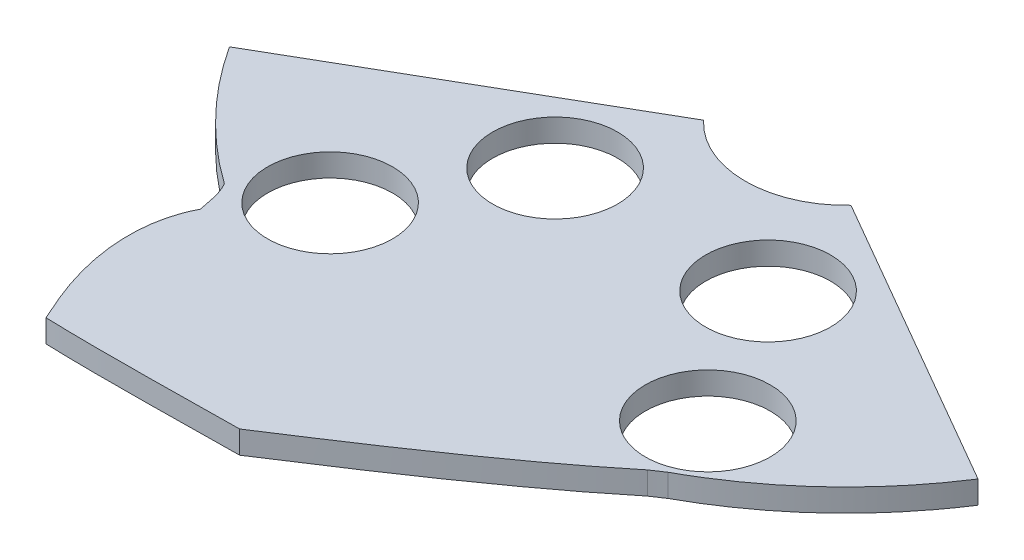
ISO-10303-21;
HEADER;
FILE_DESCRIPTION(('STEP AP214'),'2;1');
FILE_NAME('part.step','',(''),(''),'','','');
FILE_SCHEMA(('AUTOMOTIVE_DESIGN { 1 0 10303 214 1 1 1 1 }'));
ENDSEC;
DATA;
#1=APPLICATION_CONTEXT('core data for automotive mechanical design processes');
#2=APPLICATION_PROTOCOL_DEFINITION('international standard','automotive_design',2000,#1);
#3=PRODUCT_CONTEXT('',#1,'mechanical');
#4=PRODUCT('Part','Part','',(#3));
#5=PRODUCT_RELATED_PRODUCT_CATEGORY('part','',(#4));
#6=PRODUCT_DEFINITION_FORMATION('','',#4);
#7=PRODUCT_DEFINITION_CONTEXT('part definition',#1,'design');
#8=PRODUCT_DEFINITION('design','',#6,#7);
#9=PRODUCT_DEFINITION_SHAPE('','',#8);
#10=(LENGTH_UNIT() NAMED_UNIT(*) SI_UNIT(.MILLI.,.METRE.));
#11=(NAMED_UNIT(*) PLANE_ANGLE_UNIT() SI_UNIT($,.RADIAN.));
#12=(NAMED_UNIT(*) SI_UNIT($,.STERADIAN.) SOLID_ANGLE_UNIT());
#13=UNCERTAINTY_MEASURE_WITH_UNIT(LENGTH_MEASURE(1.E-05),#10,'distance_accuracy_value','');
#14=(GEOMETRIC_REPRESENTATION_CONTEXT(3) GLOBAL_UNCERTAINTY_ASSIGNED_CONTEXT((#13)) GLOBAL_UNIT_ASSIGNED_CONTEXT((#10,
#11,#12)) REPRESENTATION_CONTEXT('',''));
#15=CARTESIAN_POINT('',(0.,0.,0.));
#16=DIRECTION('',(0.,0.,1.));
#17=DIRECTION('',(1.,0.,0.));
#18=AXIS2_PLACEMENT_3D('',#15,#16,#17);
#19=CARTESIAN_POINT('',(-56.6884858522696,-91.736,54.301261576579));
#20=DIRECTION('',(0.,-1.,0.));
#21=DIRECTION('',(0.,0.,-1.));
#22=AXIS2_PLACEMENT_3D('',#19,#20,#21);
#23=PLANE('',#22);
#24=CARTESIAN_POINT('',(18.75,-91.736,32.476));
#25=DIRECTION('',(0.,-1.,0.));
#26=DIRECTION('',(0.,0.,-1.));
#27=AXIS2_PLACEMENT_3D('',#24,#25,#26);
#28=CIRCLE('',#27,10.999845998306);
#29=CARTESIAN_POINT('',(18.75,-91.736,21.476154001694));
#30=VERTEX_POINT('',#29);
#31=EDGE_CURVE('E441',#30,#30,#28,.T.);
#32=ORIENTED_EDGE('',*,*,#31,.F.);
#33=EDGE_LOOP('',(#32));
#34=FACE_BOUND('',#33,.T.);
#35=CARTESIAN_POINT('',(-33.25,-91.736,57.591));
#36=DIRECTION('',(0.,-1.,0.));
#37=DIRECTION('',(0.,0.,-1.));
#38=AXIS2_PLACEMENT_3D('',#35,#36,#37);
#39=CIRCLE('',#38,10.999845998306);
#40=CARTESIAN_POINT('',(-33.25,-91.736,46.591154001694));
#41=VERTEX_POINT('',#40);
#42=EDGE_CURVE('E422',#41,#41,#39,.T.);
#43=ORIENTED_EDGE('',*,*,#42,.F.);
#44=EDGE_LOOP('',(#43));
#45=FACE_BOUND('',#44,.T.);
#46=CARTESIAN_POINT('',(-65.8942438215736,-91.736,42.6629141284688));
#47=CARTESIAN_POINT('',(-64.5474908601946,-91.736,44.7422746970416));
#48=CARTESIAN_POINT('',(-63.1027512089931,-91.736,46.7591809472804));
#49=CARTESIAN_POINT('',(-60.0311648745791,-91.736,50.6430314481892));
#50=CARTESIAN_POINT('',(-58.4020734791186,-91.736,52.512507702137));
#51=CARTESIAN_POINT('',(-53.2612747027594,-91.736,57.878806795853));
#52=CARTESIAN_POINT('',(-49.496356291069,-91.736,61.1304947701738));
#53=CARTESIAN_POINT('',(-45.4574809101117,-91.736,63.9990028967301));
#54=B_SPLINE_CURVE_WITH_KNOTS('',3,(#46,#47,#48,#49,#50,#51,#52,#53),.UNSPECIFIED.,.F.,.F.,(4,2,
2,4),(0.,0.25,0.5,0.999998503744995),.UNSPECIFIED.);
#55=CARTESIAN_POINT('',(-45.4574809101117,-91.736,63.9990028967301));
#56=VERTEX_POINT('',#55);
#57=CARTESIAN_POINT('',(-65.8942438215736,-91.736,42.6629141284688));
#58=VERTEX_POINT('',#57);
#59=EDGE_CURVE('E378',#56,#58,#54,.F.);
#60=ORIENTED_EDGE('',*,*,#59,.T.);
#61=DIRECTION('',(0.866025113443951,0.,-0.500000502884138));
#62=VECTOR('',#61,1.);
#63=CARTESIAN_POINT('',(-65.8942438215736,-91.736,42.6629141284688));
#64=LINE('',#63,#62);
#65=CARTESIAN_POINT('',(-12.9766531358799,-91.736,12.1108879302399));
#66=VERTEX_POINT('',#65);
#67=EDGE_CURVE('E103',#58,#66,#64,.T.);
#68=ORIENTED_EDGE('',*,*,#67,.T.);
#69=CARTESIAN_POINT('',(0.,-91.736,0.));
#70=DIRECTION('',(0.,1.,0.));
#71=DIRECTION('',(0.,0.,-1.));
#72=AXIS2_PLACEMENT_3D('',#69,#70,#71);
#73=CIRCLE('',#72,17.7501305084715);
#74=CARTESIAN_POINT('',(12.9766531358511,-91.736,12.1108879302707));
#75=VERTEX_POINT('',#74);
#76=EDGE_CURVE('E272',#66,#75,#73,.T.);
#77=ORIENTED_EDGE('',*,*,#76,.T.);
#78=DIRECTION('',(0.866025113442765,0.,0.500000502886192));
#79=VECTOR('',#78,1.);
#80=CARTESIAN_POINT('',(12.9766531358511,-91.736,12.1108879302707));
#81=LINE('',#80,#79);
#82=CARTESIAN_POINT('',(65.8946490574718,-91.736,42.6631480920524));
#83=VERTEX_POINT('',#82);
#84=EDGE_CURVE('E249',#75,#83,#81,.T.);
#85=ORIENTED_EDGE('',*,*,#84,.T.);
#86=CARTESIAN_POINT('',(37.5957197584784,-91.736,68.9109267864233));
#87=CARTESIAN_POINT('',(40.4495953099681,-91.736,67.3534566445792));
#88=CARTESIAN_POINT('',(43.204718398884,-91.736,65.6218564831745));
#89=CARTESIAN_POINT('',(48.4802343379206,-91.736,61.824946723478));
#90=CARTESIAN_POINT('',(51.001907321745,-91.736,59.7629238479459));
#91=CARTESIAN_POINT('',(55.7673162148434,-91.736,55.3437989947092));
#92=CARTESIAN_POINT('',(58.0128073926613,-91.736,52.9858013582049));
#93=CARTESIAN_POINT('',(62.1928793347426,-91.736,48.0099855299953));
#94=CARTESIAN_POINT('',(64.1285228158726,-91.736,45.3912298354426));
#95=CARTESIAN_POINT('',(65.8946490574718,-91.736,42.6631480920524));
#96=B_SPLINE_CURVE_WITH_KNOTS('',3,(#86,#87,#88,#89,#90,#91,#92,#93,#94,#95),.UNSPECIFIED.,.F.,
.F.,(4,2,2,2,4),(0.,0.25,0.5,0.75,1.),.UNSPECIFIED.);
#97=CARTESIAN_POINT('',(37.5957197584784,-91.736,68.9109267864233));
#98=VERTEX_POINT('',#97);
#99=EDGE_CURVE('E244',#83,#98,#96,.F.);
#100=ORIENTED_EDGE('',*,*,#99,.T.);
#101=CARTESIAN_POINT('',(35.4050091196591,-91.736,70.3787300846418));
#102=CARTESIAN_POINT('',(35.5953555222512,-91.736,70.2464927646807));
#103=CARTESIAN_POINT('',(35.9696760657468,-91.736,69.9864450579514));
#104=CARTESIAN_POINT('',(36.5268235358578,-91.736,69.6112346563219));
#105=CARTESIAN_POINT('',(37.0663579190638,-91.736,69.2536370543177));
#106=CARTESIAN_POINT('',(37.4216631977097,-91.736,69.0236115123833));
#107=CARTESIAN_POINT('',(37.5957204018097,-91.736,68.9109264353326));
#108=B_SPLINE_CURVE_WITH_KNOTS('',3,(#101,#102,#103,#104,#105,#106,#107),.UNSPECIFIED.,.F.,.F.,
(4,1,1,1,4),(0.,0.263661321014348,0.518496003270313,0.764120477598354,0.999999722877412),.UNSPECIFIED.);
#109=CARTESIAN_POINT('',(35.4050091196591,-91.736,70.3787300846418));
#110=VERTEX_POINT('',#109);
#111=EDGE_CURVE('E321',#98,#110,#108,.F.);
#112=ORIENTED_EDGE('',*,*,#111,.T.);
#113=CARTESIAN_POINT('',(-6.73253175991147,-91.736,100.037170561056));
#114=CARTESIAN_POINT('',(-5.34630660215472,-91.736,99.1392344509291));
#115=CARTESIAN_POINT('',(-2.80167332759808,-91.736,97.4909321592919));
#116=CARTESIAN_POINT('',(3.17006895406922,-91.736,93.5946947569014));
#117=CARTESIAN_POINT('',(10.7122803870103,-91.736,88.5936129436204));
#118=CARTESIAN_POINT('',(17.489969662467,-91.736,83.900170257636));
#119=CARTESIAN_POINT('',(21.3258616627546,-91.736,81.1520962084655));
#120=CARTESIAN_POINT('',(23.185664611394,-91.736,79.8062689400434));
#121=CARTESIAN_POINT('',(25.1931857881614,-91.736,78.3306274279739));
#122=CARTESIAN_POINT('',(27.3354217863764,-91.736,76.7257185403757));
#123=CARTESIAN_POINT('',(28.9937595264603,-91.736,75.462880515536));
#124=CARTESIAN_POINT('',(30.4639698484272,-91.736,74.3264825266474));
#125=CARTESIAN_POINT('',(31.7482003840499,-91.736,73.3209545373628));
#126=CARTESIAN_POINT('',(32.9984502753082,-91.736,72.3287805314806));
#127=CARTESIAN_POINT('',(34.2150720365226,-91.736,71.3513047612209));
#128=CARTESIAN_POINT('',(35.0114565070231,-91.736,70.7003936884527));
#129=CARTESIAN_POINT('',(35.4050097024483,-91.736,70.3787297910331));
#130=B_SPLINE_CURVE_WITH_KNOTS('',3,(#113,#114,#115,#116,#117,#118,#119,#120,#121,#122,#123,
#124,#125,#126,#127,#128,#129),.UNSPECIFIED.,.F.,.F.,(4,1,1,1,1,1,1,1,1,1,1,1,1,1,4),
(1.23564092291417E-08,0.0961072285133107,0.176419852084043,0.414910652755476,0.622676188591791,
0.656085661289299,0.689485728620418,0.756258931920965,0.801061746391034,0.845241119834624,
0.877548504882489,0.909188245912283,0.940149897490484,0.970423589379137,1.),.UNSPECIFIED.);
#131=CARTESIAN_POINT('',(-6.73253175991147,-91.736,100.037170561056));
#132=VERTEX_POINT('',#131);
#133=EDGE_CURVE('E129',#110,#132,#130,.F.);
#134=ORIENTED_EDGE('',*,*,#133,.T.);
#135=CARTESIAN_POINT('',(-6.73253175991147,-91.736,100.037170561056));
#136=CARTESIAN_POINT('',(-18.3266394816797,-91.736,100.149679243875));
#137=CARTESIAN_POINT('',(-30.1799119938619,-91.736,100.458313603783));
#138=CARTESIAN_POINT('',(-40.7448806088915,-91.736,100.117358231126));
#139=B_SPLINE_CURVE_WITH_KNOTS('',3,(#135,#136,#137,#138),.UNSPECIFIED.,.F.,.F.,(4,4),
(-7.58549912933041E-06,1.00000185032628),.UNSPECIFIED.);
#140=CARTESIAN_POINT('',(-40.7448806088915,-91.736,100.117358231126));
#141=VERTEX_POINT('',#140);
#142=EDGE_CURVE('E122',#132,#141,#139,.T.);
#143=ORIENTED_EDGE('',*,*,#142,.T.);
#144=CARTESIAN_POINT('',(-43.69978000817,-91.736,69.9751321491997));
#145=CARTESIAN_POINT('',(-43.8258751992396,-91.736,70.2229224087127));
#146=CARTESIAN_POINT('',(-44.0777675180425,-91.736,70.7179167558832));
#147=CARTESIAN_POINT('',(-44.4120485944769,-91.736,71.4806829738377));
#148=CARTESIAN_POINT('',(-44.7145916870787,-91.736,72.2554495832917));
#149=CARTESIAN_POINT('',(-44.9831339082681,-91.736,73.0429860342755));
#150=CARTESIAN_POINT('',(-45.388318048313,-91.736,74.4135641806145));
#151=CARTESIAN_POINT('',(-45.8049760848263,-91.736,76.4257385547271));
#152=CARTESIAN_POINT('',(-46.0479550109228,-91.736,79.0521988723503));
#153=CARTESIAN_POINT('',(-46.0355249732305,-91.736,81.7228745288368));
#154=CARTESIAN_POINT('',(-45.7997248202168,-91.736,84.3704180167646));
#155=CARTESIAN_POINT('',(-45.3644099415651,-91.736,87.0193280475513));
#156=CARTESIAN_POINT('',(-44.7603474208787,-91.736,89.6091433834553));
#157=CARTESIAN_POINT('',(-44.126122264983,-91.736,91.7306709927925));
#158=CARTESIAN_POINT('',(-43.5526828789689,-91.736,93.4005265005966));
#159=CARTESIAN_POINT('',(-42.9391785439354,-91.736,95.0540720782557));
#160=CARTESIAN_POINT('',(-42.103875606645,-91.736,97.0959121184689));
#161=CARTESIAN_POINT('',(-41.2953680536431,-91.736,98.9105742493697));
#162=CARTESIAN_POINT('',(-40.8369102206711,-91.736,99.9156100125213));
#163=CARTESIAN_POINT('',(-40.7448806088915,-91.736,100.117358231126));
#164=B_SPLINE_CURVE_WITH_KNOTS('',3,(#144,#145,#146,#147,#148,#149,#150,#151,#152,#153,#154,
#155,#156,#157,#158,#159,#160,#161,#162,#163),.UNSPECIFIED.,.F.,.F.,(4,1,1,1,1,1,1,1,1,1,1,1,1,
1,1,1,1,4),(-4.6314063695263E-12,0.0265900897019296,0.0531172873806723,0.0796200806786659,
0.106131698240757,0.132680609636152,0.216304254194175,0.302163519882833,0.384535352486102,
0.471439613819969,0.556140868642182,0.641112876834887,0.725644631248309,0.767823389742302,
0.809984304263501,0.89433397824993,0.978789150698395,1.00000033554632),.UNSPECIFIED.);
#165=CARTESIAN_POINT('',(-43.69978000817,-91.736,69.9751321491997));
#166=VERTEX_POINT('',#165);
#167=EDGE_CURVE('E126',#141,#166,#164,.F.);
#168=ORIENTED_EDGE('',*,*,#167,.T.);
#169=CARTESIAN_POINT('',(-45.4574809101117,-91.736,63.9990028967301));
#170=CARTESIAN_POINT('',(-45.4156967068917,-91.736,64.073122017678));
#171=CARTESIAN_POINT('',(-45.3329191841185,-91.736,64.219957346526));
#172=CARTESIAN_POINT('',(-45.2176051404198,-91.736,64.4423313005604));
#173=CARTESIAN_POINT('',(-45.088200084432,-91.736,64.7081920485171));
#174=CARTESIAN_POINT('',(-44.9482419680022,-91.736,65.0234279414939));
#175=CARTESIAN_POINT('',(-44.7576372970209,-91.736,65.5031657963035));
#176=CARTESIAN_POINT('',(-44.5479965677649,-91.736,66.129307159601));
#177=CARTESIAN_POINT('',(-44.3472502154352,-91.736,66.8711728721295));
#178=CARTESIAN_POINT('',(-44.1696646182759,-91.736,67.6547978744291));
#179=CARTESIAN_POINT('',(-44.0119661161652,-91.736,68.4331426291323));
#180=CARTESIAN_POINT('',(-43.8875510527751,-91.736,69.0693352643155));
#181=CARTESIAN_POINT('',(-43.7846865828507,-91.736,69.5755456512685));
#182=CARTESIAN_POINT('',(-43.7323458446686,-91.736,69.8218712058832));
#183=CARTESIAN_POINT('',(-43.69978000817,-91.736,69.9751321491997));
#184=B_SPLINE_CURVE_WITH_KNOTS('',3,(#169,#170,#171,#172,#173,#174,#175,#176,#177,#178,#179,
#180,#181,#182,#183),.UNSPECIFIED.,.F.,.F.,(4,1,1,1,1,1,1,1,1,1,1,1,4),(0.,0.0407768066016325,
0.0807817973780872,0.12003239966095,0.182477563502951,0.246034951419214,0.367385225286607,
0.498698061298083,0.614216378888804,0.752427544621535,0.879305034699485,0.924904082872548,
0.999997651810928),.UNSPECIFIED.);
#185=EDGE_CURVE('E51',#166,#56,#184,.F.);
#186=ORIENTED_EDGE('',*,*,#185,.T.);
#187=EDGE_LOOP('',(#60,#68,#77,#85,#100,#112,#134,#143,#168,#186));
#188=FACE_BOUND('',#187,.T.);
#189=CARTESIAN_POINT('',(33.25,-91.736,57.591));
#190=DIRECTION('',(0.,-1.,0.));
#191=DIRECTION('',(0.,0.,-1.));
#192=AXIS2_PLACEMENT_3D('',#189,#190,#191);
#193=CIRCLE('',#192,10.999845998306);
#194=CARTESIAN_POINT('',(33.25,-91.736,46.591154001694));
#195=VERTEX_POINT('',#194);
#196=EDGE_CURVE('E429',#195,#195,#193,.T.);
#197=ORIENTED_EDGE('',*,*,#196,.F.);
#198=EDGE_LOOP('',(#197));
#199=FACE_BOUND('',#198,.T.);
#200=CARTESIAN_POINT('',(-18.75,-91.736,32.476));
#201=DIRECTION('',(0.,-1.,0.));
#202=DIRECTION('',(0.,0.,-1.));
#203=AXIS2_PLACEMENT_3D('',#200,#201,#202);
#204=CIRCLE('',#203,10.999845998306);
#205=CARTESIAN_POINT('',(-18.75,-91.736,21.476154001694));
#206=VERTEX_POINT('',#205);
#207=EDGE_CURVE('E447',#206,#206,#204,.T.);
#208=ORIENTED_EDGE('',*,*,#207,.F.);
#209=EDGE_LOOP('',(#208));
#210=FACE_BOUND('',#209,.T.);
#211=ADVANCED_FACE('F30',(#34,#45,#188,#199,#210),#23,.T.);
#212=CARTESIAN_POINT('',(-56.6884858522696,-87.736,54.301261576579));
#213=DIRECTION('',(0.,-1.,0.));
#214=DIRECTION('',(0.,0.,-1.));
#215=AXIS2_PLACEMENT_3D('',#212,#213,#214);
#216=PLANE('',#215);
#217=CARTESIAN_POINT('',(18.75,-87.736,32.476));
#218=DIRECTION('',(0.,-1.,0.));
#219=DIRECTION('',(0.,0.,-1.));
#220=AXIS2_PLACEMENT_3D('',#217,#218,#219);
#221=CIRCLE('',#220,10.999845998306);
#222=CARTESIAN_POINT('',(18.75,-87.736,21.476154001694));
#223=VERTEX_POINT('',#222);
#224=EDGE_CURVE('E444',#223,#223,#221,.T.);
#225=ORIENTED_EDGE('',*,*,#224,.T.);
#226=EDGE_LOOP('',(#225));
#227=FACE_BOUND('',#226,.T.);
#228=CARTESIAN_POINT('',(-33.25,-87.736,57.591));
#229=DIRECTION('',(0.,-1.,0.));
#230=DIRECTION('',(0.,0.,-1.));
#231=AXIS2_PLACEMENT_3D('',#228,#229,#230);
#232=CIRCLE('',#231,10.999845998306);
#233=CARTESIAN_POINT('',(-33.25,-87.736,46.591154001694));
#234=VERTEX_POINT('',#233);
#235=EDGE_CURVE('E424',#234,#234,#232,.T.);
#236=ORIENTED_EDGE('',*,*,#235,.T.);
#237=EDGE_LOOP('',(#236));
#238=FACE_BOUND('',#237,.T.);
#239=CARTESIAN_POINT('',(-45.4574809101117,-87.736,63.9990028967301));
#240=CARTESIAN_POINT('',(-49.496356291069,-87.736,61.1304947701738));
#241=CARTESIAN_POINT('',(-53.2612747027594,-87.736,57.878806795853));
#242=CARTESIAN_POINT('',(-58.4020734791186,-87.736,52.512507702137));
#243=CARTESIAN_POINT('',(-60.0311648745791,-87.736,50.6430314481892));
#244=CARTESIAN_POINT('',(-63.1027512089931,-87.736,46.7591809472804));
#245=CARTESIAN_POINT('',(-64.5474908601946,-87.736,44.7422746970416));
#246=CARTESIAN_POINT('',(-65.8942438215736,-87.736,42.6629141284688));
#247=B_SPLINE_CURVE_WITH_KNOTS('',3,(#239,#240,#241,#242,#243,#244,#245,#246),.UNSPECIFIED.,.F.,
.F.,(4,2,2,4),(0.,0.499998503744997,0.749998503744997,0.999998503744995),.UNSPECIFIED.);
#248=CARTESIAN_POINT('',(-45.4574809101117,-87.736,63.9990028967301));
#249=VERTEX_POINT('',#248);
#250=CARTESIAN_POINT('',(-65.8942438215736,-87.736,42.6629141284688));
#251=VERTEX_POINT('',#250);
#252=EDGE_CURVE('E405',#249,#251,#247,.T.);
#253=ORIENTED_EDGE('',*,*,#252,.F.);
#254=CARTESIAN_POINT('',(-43.69978000817,-87.736,69.9751321491997));
#255=CARTESIAN_POINT('',(-43.7323458446686,-87.736,69.8218712058832));
#256=CARTESIAN_POINT('',(-43.7846865828507,-87.736,69.5755456512685));
#257=CARTESIAN_POINT('',(-43.8875510527751,-87.736,69.0693352643155));
#258=CARTESIAN_POINT('',(-44.0119661161652,-87.736,68.4331426291323));
#259=CARTESIAN_POINT('',(-44.1696646182759,-87.736,67.6547978744291));
#260=CARTESIAN_POINT('',(-44.3472502154352,-87.736,66.8711728721295));
#261=CARTESIAN_POINT('',(-44.5479965677649,-87.736,66.129307159601));
#262=CARTESIAN_POINT('',(-44.7576372970209,-87.736,65.5031657963035));
#263=CARTESIAN_POINT('',(-44.9482419680022,-87.736,65.0234279414939));
#264=CARTESIAN_POINT('',(-45.088200084432,-87.736,64.7081920485171));
#265=CARTESIAN_POINT('',(-45.2176051404198,-87.736,64.4423313005604));
#266=CARTESIAN_POINT('',(-45.3329191841185,-87.736,64.219957346526));
#267=CARTESIAN_POINT('',(-45.4156967068917,-87.736,64.073122017678));
#268=CARTESIAN_POINT('',(-45.4574809101117,-87.736,63.9990028967301));
#269=B_SPLINE_CURVE_WITH_KNOTS('',3,(#254,#255,#256,#257,#258,#259,#260,#261,#262,#263,#264,
#265,#266,#267,#268),.UNSPECIFIED.,.F.,.F.,(4,1,1,1,1,1,1,1,1,1,1,1,4),(0.,0.0750935689383686,
0.120692617111432,0.247570107189382,0.385781272922112,0.501299590512833,0.632612426524309,
0.753962700391702,0.817520088307965,0.879965252149966,0.919215854432829,0.959220845209284,
0.999997651810928),.UNSPECIFIED.);
#270=CARTESIAN_POINT('',(-43.69978000817,-87.736,69.9751321491997));
#271=VERTEX_POINT('',#270);
#272=EDGE_CURVE('E94',#271,#249,#269,.T.);
#273=ORIENTED_EDGE('',*,*,#272,.F.);
#274=CARTESIAN_POINT('',(-40.7448806088915,-87.736,100.117358231126));
#275=CARTESIAN_POINT('',(-40.8369102206711,-87.736,99.9156100125213));
#276=CARTESIAN_POINT('',(-41.2953680536431,-87.736,98.9105742493697));
#277=CARTESIAN_POINT('',(-42.103875606645,-87.736,97.0959121184689));
#278=CARTESIAN_POINT('',(-42.9391785439354,-87.736,95.0540720782557));
#279=CARTESIAN_POINT('',(-43.5526828789689,-87.736,93.4005265005966));
#280=CARTESIAN_POINT('',(-44.126122264983,-87.736,91.7306709927925));
#281=CARTESIAN_POINT('',(-44.7603474208787,-87.736,89.6091433834553));
#282=CARTESIAN_POINT('',(-45.3644099415651,-87.736,87.0193280475513));
#283=CARTESIAN_POINT('',(-45.7997248202168,-87.736,84.3704180167646));
#284=CARTESIAN_POINT('',(-46.0355249732305,-87.736,81.7228745288368));
#285=CARTESIAN_POINT('',(-46.0479550109228,-87.736,79.0521988723503));
#286=CARTESIAN_POINT('',(-45.8049760848263,-87.736,76.4257385547271));
#287=CARTESIAN_POINT('',(-45.388318048313,-87.736,74.4135641806145));
#288=CARTESIAN_POINT('',(-44.9831339082681,-87.736,73.0429860342755));
#289=CARTESIAN_POINT('',(-44.7145916870787,-87.736,72.2554495832917));
#290=CARTESIAN_POINT('',(-44.4120485944769,-87.736,71.4806829738377));
#291=CARTESIAN_POINT('',(-44.0777675180425,-87.736,70.7179167558832));
#292=CARTESIAN_POINT('',(-43.8258751992396,-87.736,70.2229224087127));
#293=CARTESIAN_POINT('',(-43.69978000817,-87.736,69.9751321491997));
#294=B_SPLINE_CURVE_WITH_KNOTS('',3,(#274,#275,#276,#277,#278,#279,#280,#281,#282,#283,#284,
#285,#286,#287,#288,#289,#290,#291,#292,#293),.UNSPECIFIED.,.F.,.F.,(4,1,1,1,1,1,1,1,1,1,1,1,1,
1,1,1,1,4),(-4.63136490984623E-12,0.0212111848432983,0.105666357291763,0.190016031278192,
0.232176945799391,0.274355704293384,0.358887458706806,0.443859466899512,0.528560721721725,
0.615464983055591,0.697836815658861,0.783696081347518,0.867319725905541,0.893868637300936,
0.920380254863027,0.946883048161021,0.973410245839764,1.00000033554632),.UNSPECIFIED.);
#295=CARTESIAN_POINT('',(-40.7448806088915,-87.736,100.117358231126));
#296=VERTEX_POINT('',#295);
#297=EDGE_CURVE('E87',#296,#271,#294,.T.);
#298=ORIENTED_EDGE('',*,*,#297,.F.);
#299=CARTESIAN_POINT('',(-6.73253175991147,-87.736,100.037170561056));
#300=CARTESIAN_POINT('',(-18.3266394816797,-87.736,100.149679243875));
#301=CARTESIAN_POINT('',(-30.1799119938619,-87.736,100.458313603783));
#302=CARTESIAN_POINT('',(-40.7448806088915,-87.736,100.117358231126));
#303=B_SPLINE_CURVE_WITH_KNOTS('',3,(#299,#300,#301,#302),.UNSPECIFIED.,.F.,.F.,(4,4),
(-7.58549912933041E-06,1.00000185032628),.UNSPECIFIED.);
#304=CARTESIAN_POINT('',(-6.73253175991147,-87.736,100.037170561056));
#305=VERTEX_POINT('',#304);
#306=EDGE_CURVE('E138',#305,#296,#303,.T.);
#307=ORIENTED_EDGE('',*,*,#306,.F.);
#308=CARTESIAN_POINT('',(35.4050097024483,-87.736,70.3787297910331));
#309=CARTESIAN_POINT('',(35.0114565070231,-87.736,70.7003936884527));
#310=CARTESIAN_POINT('',(34.2150720365226,-87.736,71.3513047612209));
#311=CARTESIAN_POINT('',(32.9984502753082,-87.736,72.3287805314806));
#312=CARTESIAN_POINT('',(31.7482003840499,-87.736,73.3209545373628));
#313=CARTESIAN_POINT('',(30.4639698484272,-87.736,74.3264825266474));
#314=CARTESIAN_POINT('',(28.9937595264603,-87.736,75.462880515536));
#315=CARTESIAN_POINT('',(27.3354217863764,-87.736,76.7257185403757));
#316=CARTESIAN_POINT('',(25.1931857881614,-87.736,78.3306274279739));
#317=CARTESIAN_POINT('',(23.185664611394,-87.736,79.8062689400434));
#318=CARTESIAN_POINT('',(21.3258616627546,-87.736,81.1520962084655));
#319=CARTESIAN_POINT('',(17.489969662467,-87.736,83.900170257636));
#320=CARTESIAN_POINT('',(10.7122803870103,-87.736,88.5936129436204));
#321=CARTESIAN_POINT('',(3.17006895406922,-87.736,93.5946947569014));
#322=CARTESIAN_POINT('',(-2.80167332759808,-87.736,97.4909321592919));
#323=CARTESIAN_POINT('',(-5.34630660215472,-87.736,99.1392344509291));
#324=CARTESIAN_POINT('',(-6.73253175991147,-87.736,100.037170561056));
#325=B_SPLINE_CURVE_WITH_KNOTS('',3,(#308,#309,#310,#311,#312,#313,#314,#315,#316,#317,#318,
#319,#320,#321,#322,#323,#324),.UNSPECIFIED.,.F.,.F.,(4,1,1,1,1,1,1,1,1,1,1,1,1,1,4),
(1.23564091313988E-08,0.0295764229772721,0.059850114865925,0.0908117664441267,0.12245150747392,
0.154758892521785,0.198938265965375,0.243741080435444,0.310514283735991,0.34391435106711,
0.377323823764618,0.585089359600934,0.823580160272366,0.903892783843099,1.),.UNSPECIFIED.);
#326=CARTESIAN_POINT('',(35.4050091196591,-87.736,70.3787300846418));
#327=VERTEX_POINT('',#326);
#328=EDGE_CURVE('E312',#327,#305,#325,.T.);
#329=ORIENTED_EDGE('',*,*,#328,.F.);
#330=CARTESIAN_POINT('',(37.5957204018097,-87.736,68.9109264353326));
#331=CARTESIAN_POINT('',(37.4216631977097,-87.736,69.0236115123833));
#332=CARTESIAN_POINT('',(37.0663579190638,-87.736,69.2536370543177));
#333=CARTESIAN_POINT('',(36.5268235358578,-87.736,69.6112346563219));
#334=CARTESIAN_POINT('',(35.9696760657468,-87.736,69.9864450579514));
#335=CARTESIAN_POINT('',(35.5953555222512,-87.736,70.2464927646807));
#336=CARTESIAN_POINT('',(35.4050091196591,-87.736,70.3787300846418));
#337=B_SPLINE_CURVE_WITH_KNOTS('',3,(#330,#331,#332,#333,#334,#335,#336),.UNSPECIFIED.,.F.,.F.,
(4,1,1,1,4),(0.,0.235879245279058,0.481503719607099,0.736338401863064,0.999999722877412),.UNSPECIFIED.);
#338=CARTESIAN_POINT('',(37.5957197584784,-87.736,68.9109267864233));
#339=VERTEX_POINT('',#338);
#340=EDGE_CURVE('E327',#339,#327,#337,.T.);
#341=ORIENTED_EDGE('',*,*,#340,.F.);
#342=CARTESIAN_POINT('',(65.8946490574718,-87.736,42.6631480920524));
#343=CARTESIAN_POINT('',(64.1285228158726,-87.736,45.3912298354426));
#344=CARTESIAN_POINT('',(62.1928793347426,-87.736,48.0099855299953));
#345=CARTESIAN_POINT('',(58.0128073926613,-87.736,52.9858013582049));
#346=CARTESIAN_POINT('',(55.7673162148434,-87.736,55.3437989947092));
#347=CARTESIAN_POINT('',(51.001907321745,-87.736,59.7629238479459));
#348=CARTESIAN_POINT('',(48.4802343379206,-87.736,61.824946723478));
#349=CARTESIAN_POINT('',(43.204718398884,-87.736,65.6218564831745));
#350=CARTESIAN_POINT('',(40.4495953099681,-87.736,67.3534566445792));
#351=CARTESIAN_POINT('',(37.5957197584784,-87.736,68.9109267864233));
#352=B_SPLINE_CURVE_WITH_KNOTS('',3,(#342,#343,#344,#345,#346,#347,#348,#349,#350,#351),
.UNSPECIFIED.,.F.,.F.,(4,2,2,2,4),(0.,0.25,0.5,0.75,1.),.UNSPECIFIED.);
#353=CARTESIAN_POINT('',(65.8946490574718,-87.736,42.6631480920524));
#354=VERTEX_POINT('',#353);
#355=EDGE_CURVE('E363',#354,#339,#352,.T.);
#356=ORIENTED_EDGE('',*,*,#355,.F.);
#357=DIRECTION('',(0.866025113442765,0.,0.500000502886192));
#358=VECTOR('',#357,1.);
#359=CARTESIAN_POINT('',(12.9766531358511,-87.736,12.1108879302707));
#360=LINE('',#359,#358);
#361=CARTESIAN_POINT('',(12.9766531358511,-87.736,12.1108879302707));
#362=VERTEX_POINT('',#361);
#363=EDGE_CURVE('E188',#362,#354,#360,.T.);
#364=ORIENTED_EDGE('',*,*,#363,.F.);
#365=CARTESIAN_POINT('',(0.,-87.736,0.));
#366=DIRECTION('',(0.,1.,0.));
#367=DIRECTION('',(0.,0.,-1.));
#368=AXIS2_PLACEMENT_3D('',#365,#366,#367);
#369=CIRCLE('',#368,17.7501305084715);
#370=CARTESIAN_POINT('',(-12.9766531358799,-87.736,12.1108879302399));
#371=VERTEX_POINT('',#370);
#372=EDGE_CURVE('E183',#371,#362,#369,.T.);
#373=ORIENTED_EDGE('',*,*,#372,.F.);
#374=DIRECTION('',(0.866025113443951,0.,-0.500000502884138));
#375=VECTOR('',#374,1.);
#376=CARTESIAN_POINT('',(-65.8942438215736,-87.736,42.6629141284688));
#377=LINE('',#376,#375);
#378=EDGE_CURVE('E189',#251,#371,#377,.T.);
#379=ORIENTED_EDGE('',*,*,#378,.F.);
#380=EDGE_LOOP('',(#253,#273,#298,#307,#329,#341,#356,#364,#373,#379));
#381=FACE_BOUND('',#380,.T.);
#382=CARTESIAN_POINT('',(33.25,-87.736,57.591));
#383=DIRECTION('',(0.,-1.,0.));
#384=DIRECTION('',(0.,0.,-1.));
#385=AXIS2_PLACEMENT_3D('',#382,#383,#384);
#386=CIRCLE('',#385,10.999845998306);
#387=CARTESIAN_POINT('',(33.25,-87.736,46.591154001694));
#388=VERTEX_POINT('',#387);
#389=EDGE_CURVE('E432',#388,#388,#386,.T.);
#390=ORIENTED_EDGE('',*,*,#389,.T.);
#391=EDGE_LOOP('',(#390));
#392=FACE_BOUND('',#391,.T.);
#393=CARTESIAN_POINT('',(-18.75,-87.736,32.476));
#394=DIRECTION('',(0.,-1.,0.));
#395=DIRECTION('',(0.,0.,-1.));
#396=AXIS2_PLACEMENT_3D('',#393,#394,#395);
#397=CIRCLE('',#396,10.999845998306);
#398=CARTESIAN_POINT('',(-18.75,-87.736,21.476154001694));
#399=VERTEX_POINT('',#398);
#400=EDGE_CURVE('E450',#399,#399,#397,.T.);
#401=ORIENTED_EDGE('',*,*,#400,.T.);
#402=EDGE_LOOP('',(#401));
#403=FACE_BOUND('',#402,.T.);
#404=ADVANCED_FACE('F208',(#227,#238,#381,#392,#403),#216,.F.);
#405=CARTESIAN_POINT('',(-45.4574809101117,-91.736,63.9990028967301));
#406=CARTESIAN_POINT('',(-49.496356291069,-91.736,61.1304947701738));
#407=CARTESIAN_POINT('',(-53.2612747027594,-91.736,57.878806795853));
#408=CARTESIAN_POINT('',(-58.4020734791186,-91.736,52.512507702137));
#409=CARTESIAN_POINT('',(-60.0311648745791,-91.736,50.6430314481892));
#410=CARTESIAN_POINT('',(-63.1027512089931,-91.736,46.7591809472804));
#411=CARTESIAN_POINT('',(-64.5474908601946,-91.736,44.7422746970416));
#412=CARTESIAN_POINT('',(-65.8942438215736,-91.736,42.6629141284688));
#413=B_SPLINE_CURVE_WITH_KNOTS('',3,(#405,#406,#407,#408,#409,#410,#411,#412),.UNSPECIFIED.,.F.,
.F.,(4,2,2,4),(0.,0.499998503744997,0.749998503744997,0.999998503744995),.UNSPECIFIED.);
#414=DIRECTION('',(0.,1.,0.));
#415=VECTOR('',#414,1.);
#416=SURFACE_OF_LINEAR_EXTRUSION('',#413,#415);
#417=ORIENTED_EDGE('',*,*,#252,.T.);
#418=DIRECTION('',(0.,1.,0.));
#419=VECTOR('',#418,1.);
#420=CARTESIAN_POINT('',(-65.8942438215736,-91.736,42.6629141284688));
#421=LINE('',#420,#419);
#422=EDGE_CURVE('E11',#58,#251,#421,.T.);
#423=ORIENTED_EDGE('',*,*,#422,.F.);
#424=ORIENTED_EDGE('',*,*,#59,.F.);
#425=DIRECTION('',(0.,1.,0.));
#426=VECTOR('',#425,1.);
#427=CARTESIAN_POINT('',(-45.4574809101117,-91.736,63.9990028967301));
#428=LINE('',#427,#426);
#429=EDGE_CURVE('E652',#56,#249,#428,.T.);
#430=ORIENTED_EDGE('',*,*,#429,.T.);
#431=EDGE_LOOP('',(#417,#423,#424,#430));
#432=FACE_BOUND('',#431,.T.);
#433=ADVANCED_FACE('F32',(#432),#416,.F.);
#434=CARTESIAN_POINT('',(-65.8942438215736,-91.736,42.6629141284688));
#435=DIRECTION('',(0.500000502884138,0.,0.866025113443951));
#436=DIRECTION('',(0.866025113443951,0.,-0.500000502884138));
#437=AXIS2_PLACEMENT_3D('',#434,#435,#436);
#438=PLANE('',#437);
#439=ORIENTED_EDGE('',*,*,#378,.T.);
#440=DIRECTION('',(0.,1.,0.));
#441=VECTOR('',#440,1.);
#442=CARTESIAN_POINT('',(-12.9766531358799,-91.736,12.1108879302399));
#443=LINE('',#442,#441);
#444=EDGE_CURVE('E42',#66,#371,#443,.T.);
#445=ORIENTED_EDGE('',*,*,#444,.F.);
#446=ORIENTED_EDGE('',*,*,#67,.F.);
#447=ORIENTED_EDGE('',*,*,#422,.T.);
#448=EDGE_LOOP('',(#439,#445,#446,#447));
#449=FACE_BOUND('',#448,.T.);
#450=ADVANCED_FACE('F469',(#449),#438,.F.);
#451=CARTESIAN_POINT('',(0.,-91.736,0.));
#452=DIRECTION('',(0.,1.,0.));
#453=DIRECTION('',(0.,0.,1.));
#454=AXIS2_PLACEMENT_3D('',#451,#452,#453);
#455=CYLINDRICAL_SURFACE('',#454,17.7501305084715);
#456=ORIENTED_EDGE('',*,*,#372,.T.);
#457=DIRECTION('',(0.,1.,0.));
#458=VECTOR('',#457,1.);
#459=CARTESIAN_POINT('',(12.9766531358511,-91.736,12.1108879302707));
#460=LINE('',#459,#458);
#461=EDGE_CURVE('E190',#75,#362,#460,.T.);
#462=ORIENTED_EDGE('',*,*,#461,.F.);
#463=ORIENTED_EDGE('',*,*,#76,.F.);
#464=ORIENTED_EDGE('',*,*,#444,.T.);
#465=EDGE_LOOP('',(#456,#462,#463,#464));
#466=FACE_BOUND('',#465,.T.);
#467=ADVANCED_FACE('F517',(#466),#455,.F.);
#468=CARTESIAN_POINT('',(12.9766531358511,-91.736,12.1108879302707));
#469=DIRECTION('',(-0.500000502886192,0.,0.866025113442766));
#470=DIRECTION('',(0.866025113442765,0.,0.500000502886192));
#471=AXIS2_PLACEMENT_3D('',#468,#469,#470);
#472=PLANE('',#471);
#473=ORIENTED_EDGE('',*,*,#363,.T.);
#474=DIRECTION('',(0.,1.,0.));
#475=VECTOR('',#474,1.);
#476=CARTESIAN_POINT('',(65.8946490574718,-91.736,42.6631480920524));
#477=LINE('',#476,#475);
#478=EDGE_CURVE('E193',#83,#354,#477,.T.);
#479=ORIENTED_EDGE('',*,*,#478,.F.);
#480=ORIENTED_EDGE('',*,*,#84,.F.);
#481=ORIENTED_EDGE('',*,*,#461,.T.);
#482=EDGE_LOOP('',(#473,#479,#480,#481));
#483=FACE_BOUND('',#482,.T.);
#484=ADVANCED_FACE('F263',(#483),#472,.F.);
#485=CARTESIAN_POINT('',(65.8946490574718,-91.736,42.6631480920524));
#486=CARTESIAN_POINT('',(64.1285228158726,-91.736,45.3912298354426));
#487=CARTESIAN_POINT('',(62.1928793347426,-91.736,48.0099855299953));
#488=CARTESIAN_POINT('',(58.0128073926613,-91.736,52.9858013582049));
#489=CARTESIAN_POINT('',(55.7673162148434,-91.736,55.3437989947092));
#490=CARTESIAN_POINT('',(51.001907321745,-91.736,59.7629238479459));
#491=CARTESIAN_POINT('',(48.4802343379206,-91.736,61.824946723478));
#492=CARTESIAN_POINT('',(43.204718398884,-91.736,65.6218564831745));
#493=CARTESIAN_POINT('',(40.4495953099681,-91.736,67.3534566445792));
#494=CARTESIAN_POINT('',(37.5957197584784,-91.736,68.9109267864233));
#495=B_SPLINE_CURVE_WITH_KNOTS('',3,(#485,#486,#487,#488,#489,#490,#491,#492,#493,#494),
.UNSPECIFIED.,.F.,.F.,(4,2,2,2,4),(0.,0.25,0.5,0.75,1.),.UNSPECIFIED.);
#496=DIRECTION('',(0.,1.,0.));
#497=VECTOR('',#496,1.);
#498=SURFACE_OF_LINEAR_EXTRUSION('',#495,#497);
#499=ORIENTED_EDGE('',*,*,#355,.T.);
#500=DIRECTION('',(0.,1.,0.));
#501=VECTOR('',#500,1.);
#502=CARTESIAN_POINT('',(37.5957197584784,-91.736,68.9109267864233));
#503=LINE('',#502,#501);
#504=EDGE_CURVE('E329',#98,#339,#503,.T.);
#505=ORIENTED_EDGE('',*,*,#504,.F.);
#506=ORIENTED_EDGE('',*,*,#99,.F.);
#507=ORIENTED_EDGE('',*,*,#478,.T.);
#508=EDGE_LOOP('',(#499,#505,#506,#507));
#509=FACE_BOUND('',#508,.T.);
#510=ADVANCED_FACE('F251',(#509),#498,.F.);
#511=CARTESIAN_POINT('',(37.5957204018097,-91.736,68.9109264353326));
#512=CARTESIAN_POINT('',(37.4216631977097,-91.736,69.0236115123833));
#513=CARTESIAN_POINT('',(37.0663579190638,-91.736,69.2536370543177));
#514=CARTESIAN_POINT('',(36.5268235358578,-91.736,69.6112346563219));
#515=CARTESIAN_POINT('',(35.9696760657468,-91.736,69.9864450579514));
#516=CARTESIAN_POINT('',(35.5953555222512,-91.736,70.2464927646807));
#517=CARTESIAN_POINT('',(35.4050091196591,-91.736,70.3787300846418));
#518=B_SPLINE_CURVE_WITH_KNOTS('',3,(#511,#512,#513,#514,#515,#516,#517),.UNSPECIFIED.,.F.,.F.,
(4,1,1,1,4),(0.,0.235879245279058,0.481503719607099,0.736338401863064,0.999999722877412),.UNSPECIFIED.);
#519=DIRECTION('',(0.,1.,0.));
#520=VECTOR('',#519,1.);
#521=SURFACE_OF_LINEAR_EXTRUSION('',#518,#520);
#522=ORIENTED_EDGE('',*,*,#340,.T.);
#523=DIRECTION('',(0.,1.,0.));
#524=VECTOR('',#523,1.);
#525=CARTESIAN_POINT('',(35.4050091196591,-91.736,70.3787300846418));
#526=LINE('',#525,#524);
#527=EDGE_CURVE('E326',#110,#327,#526,.T.);
#528=ORIENTED_EDGE('',*,*,#527,.F.);
#529=ORIENTED_EDGE('',*,*,#111,.F.);
#530=ORIENTED_EDGE('',*,*,#504,.T.);
#531=EDGE_LOOP('',(#522,#528,#529,#530));
#532=FACE_BOUND('',#531,.T.);
#533=ADVANCED_FACE('F262',(#532),#521,.F.);
#534=CARTESIAN_POINT('',(35.4050097024483,-91.736,70.3787297910331));
#535=CARTESIAN_POINT('',(35.0114565070231,-91.736,70.7003936884527));
#536=CARTESIAN_POINT('',(34.2150720365226,-91.736,71.3513047612209));
#537=CARTESIAN_POINT('',(32.9984502753082,-91.736,72.3287805314806));
#538=CARTESIAN_POINT('',(31.7482003840499,-91.736,73.3209545373628));
#539=CARTESIAN_POINT('',(30.4639698484272,-91.736,74.3264825266474));
#540=CARTESIAN_POINT('',(28.9937595264603,-91.736,75.462880515536));
#541=CARTESIAN_POINT('',(27.3354217863764,-91.736,76.7257185403757));
#542=CARTESIAN_POINT('',(25.1931857881614,-91.736,78.3306274279739));
#543=CARTESIAN_POINT('',(23.185664611394,-91.736,79.8062689400434));
#544=CARTESIAN_POINT('',(21.3258616627546,-91.736,81.1520962084655));
#545=CARTESIAN_POINT('',(17.489969662467,-91.736,83.900170257636));
#546=CARTESIAN_POINT('',(10.7122803870103,-91.736,88.5936129436204));
#547=CARTESIAN_POINT('',(3.17006895406922,-91.736,93.5946947569014));
#548=CARTESIAN_POINT('',(-2.80167332759808,-91.736,97.4909321592919));
#549=CARTESIAN_POINT('',(-5.34630660215472,-91.736,99.1392344509291));
#550=CARTESIAN_POINT('',(-6.73253175991147,-91.736,100.037170561056));
#551=B_SPLINE_CURVE_WITH_KNOTS('',3,(#534,#535,#536,#537,#538,#539,#540,#541,#542,#543,#544,
#545,#546,#547,#548,#549,#550),.UNSPECIFIED.,.F.,.F.,(4,1,1,1,1,1,1,1,1,1,1,1,1,1,4),
(1.23564091313988E-08,0.0295764229772721,0.059850114865925,0.0908117664441267,0.12245150747392,
0.154758892521785,0.198938265965375,0.243741080435444,0.310514283735991,0.34391435106711,
0.377323823764618,0.585089359600934,0.823580160272366,0.903892783843099,1.),.UNSPECIFIED.);
#552=DIRECTION('',(0.,1.,0.));
#553=VECTOR('',#552,1.);
#554=SURFACE_OF_LINEAR_EXTRUSION('',#551,#553);
#555=ORIENTED_EDGE('',*,*,#328,.T.);
#556=DIRECTION('',(0.,1.,0.));
#557=VECTOR('',#556,1.);
#558=CARTESIAN_POINT('',(-6.73253175991147,-91.736,100.037170561056));
#559=LINE('',#558,#557);
#560=EDGE_CURVE('E139',#132,#305,#559,.T.);
#561=ORIENTED_EDGE('',*,*,#560,.F.);
#562=ORIENTED_EDGE('',*,*,#133,.F.);
#563=ORIENTED_EDGE('',*,*,#527,.T.);
#564=EDGE_LOOP('',(#555,#561,#562,#563));
#565=FACE_BOUND('',#564,.T.);
#566=ADVANCED_FACE('F288',(#565),#554,.F.);
#567=DIRECTION('',(0.,1.,0.));
#568=VECTOR('',#567,1.);
#569=SURFACE_OF_LINEAR_EXTRUSION('',#139,#568);
#570=ORIENTED_EDGE('',*,*,#306,.T.);
#571=DIRECTION('',(0.,1.,0.));
#572=VECTOR('',#571,1.);
#573=CARTESIAN_POINT('',(-40.7448806088915,-91.736,100.117358231126));
#574=LINE('',#573,#572);
#575=EDGE_CURVE('E135',#141,#296,#574,.T.);
#576=ORIENTED_EDGE('',*,*,#575,.F.);
#577=ORIENTED_EDGE('',*,*,#142,.F.);
#578=ORIENTED_EDGE('',*,*,#560,.T.);
#579=EDGE_LOOP('',(#570,#576,#577,#578));
#580=FACE_BOUND('',#579,.T.);
#581=ADVANCED_FACE('F136',(#580),#569,.F.);
#582=CARTESIAN_POINT('',(-40.7448806088915,-91.736,100.117358231126));
#583=CARTESIAN_POINT('',(-40.8369102206711,-91.736,99.9156100125213));
#584=CARTESIAN_POINT('',(-41.2953680536431,-91.736,98.9105742493697));
#585=CARTESIAN_POINT('',(-42.103875606645,-91.736,97.0959121184689));
#586=CARTESIAN_POINT('',(-42.9391785439354,-91.736,95.0540720782557));
#587=CARTESIAN_POINT('',(-43.5526828789689,-91.736,93.4005265005966));
#588=CARTESIAN_POINT('',(-44.126122264983,-91.736,91.7306709927925));
#589=CARTESIAN_POINT('',(-44.7603474208787,-91.736,89.6091433834553));
#590=CARTESIAN_POINT('',(-45.3644099415651,-91.736,87.0193280475513));
#591=CARTESIAN_POINT('',(-45.7997248202168,-91.736,84.3704180167646));
#592=CARTESIAN_POINT('',(-46.0355249732305,-91.736,81.7228745288368));
#593=CARTESIAN_POINT('',(-46.0479550109228,-91.736,79.0521988723503));
#594=CARTESIAN_POINT('',(-45.8049760848263,-91.736,76.4257385547271));
#595=CARTESIAN_POINT('',(-45.388318048313,-91.736,74.4135641806145));
#596=CARTESIAN_POINT('',(-44.9831339082681,-91.736,73.0429860342755));
#597=CARTESIAN_POINT('',(-44.7145916870787,-91.736,72.2554495832917));
#598=CARTESIAN_POINT('',(-44.4120485944769,-91.736,71.4806829738377));
#599=CARTESIAN_POINT('',(-44.0777675180425,-91.736,70.7179167558832));
#600=CARTESIAN_POINT('',(-43.8258751992396,-91.736,70.2229224087127));
#601=CARTESIAN_POINT('',(-43.69978000817,-91.736,69.9751321491997));
#602=B_SPLINE_CURVE_WITH_KNOTS('',3,(#582,#583,#584,#585,#586,#587,#588,#589,#590,#591,#592,
#593,#594,#595,#596,#597,#598,#599,#600,#601),.UNSPECIFIED.,.F.,.F.,(4,1,1,1,1,1,1,1,1,1,1,1,1,
1,1,1,1,4),(-4.63136490984623E-12,0.0212111848432983,0.105666357291763,0.190016031278192,
0.232176945799391,0.274355704293384,0.358887458706806,0.443859466899512,0.528560721721725,
0.615464983055591,0.697836815658861,0.783696081347518,0.867319725905541,0.893868637300936,
0.920380254863027,0.946883048161021,0.973410245839764,1.00000033554632),.UNSPECIFIED.);
#603=DIRECTION('',(0.,1.,0.));
#604=VECTOR('',#603,1.);
#605=SURFACE_OF_LINEAR_EXTRUSION('',#602,#604);
#606=ORIENTED_EDGE('',*,*,#297,.T.);
#607=DIRECTION('',(0.,1.,0.));
#608=VECTOR('',#607,1.);
#609=CARTESIAN_POINT('',(-43.69978000817,-91.736,69.9751321491997));
#610=LINE('',#609,#608);
#611=EDGE_CURVE('E140',#166,#271,#610,.T.);
#612=ORIENTED_EDGE('',*,*,#611,.F.);
#613=ORIENTED_EDGE('',*,*,#167,.F.);
#614=ORIENTED_EDGE('',*,*,#575,.T.);
#615=EDGE_LOOP('',(#606,#612,#613,#614));
#616=FACE_BOUND('',#615,.T.);
#617=ADVANCED_FACE('F143',(#616),#605,.F.);
#618=CARTESIAN_POINT('',(-43.69978000817,-91.736,69.9751321491997));
#619=CARTESIAN_POINT('',(-43.7323458446686,-91.736,69.8218712058832));
#620=CARTESIAN_POINT('',(-43.7846865828507,-91.736,69.5755456512685));
#621=CARTESIAN_POINT('',(-43.8875510527751,-91.736,69.0693352643155));
#622=CARTESIAN_POINT('',(-44.0119661161652,-91.736,68.4331426291323));
#623=CARTESIAN_POINT('',(-44.1696646182759,-91.736,67.6547978744291));
#624=CARTESIAN_POINT('',(-44.3472502154352,-91.736,66.8711728721295));
#625=CARTESIAN_POINT('',(-44.5479965677649,-91.736,66.129307159601));
#626=CARTESIAN_POINT('',(-44.7576372970209,-91.736,65.5031657963035));
#627=CARTESIAN_POINT('',(-44.9482419680022,-91.736,65.0234279414939));
#628=CARTESIAN_POINT('',(-45.088200084432,-91.736,64.7081920485171));
#629=CARTESIAN_POINT('',(-45.2176051404198,-91.736,64.4423313005604));
#630=CARTESIAN_POINT('',(-45.3329191841185,-91.736,64.219957346526));
#631=CARTESIAN_POINT('',(-45.4156967068917,-91.736,64.073122017678));
#632=CARTESIAN_POINT('',(-45.4574809101117,-91.736,63.9990028967301));
#633=B_SPLINE_CURVE_WITH_KNOTS('',3,(#618,#619,#620,#621,#622,#623,#624,#625,#626,#627,#628,
#629,#630,#631,#632),.UNSPECIFIED.,.F.,.F.,(4,1,1,1,1,1,1,1,1,1,1,1,4),(0.,0.0750935689383686,
0.120692617111432,0.247570107189382,0.385781272922112,0.501299590512833,0.632612426524309,
0.753962700391702,0.817520088307965,0.879965252149966,0.919215854432829,0.959220845209284,
0.999997651810928),.UNSPECIFIED.);
#634=DIRECTION('',(0.,1.,0.));
#635=VECTOR('',#634,1.);
#636=SURFACE_OF_LINEAR_EXTRUSION('',#633,#635);
#637=ORIENTED_EDGE('',*,*,#272,.T.);
#638=ORIENTED_EDGE('',*,*,#429,.F.);
#639=ORIENTED_EDGE('',*,*,#185,.F.);
#640=ORIENTED_EDGE('',*,*,#611,.T.);
#641=EDGE_LOOP('',(#637,#638,#639,#640));
#642=FACE_BOUND('',#641,.T.);
#643=ADVANCED_FACE('F163',(#642),#636,.F.);
#644=CARTESIAN_POINT('',(-33.25,-91.736,57.591));
#645=DIRECTION('',(0.,1.,0.));
#646=DIRECTION('',(0.,0.,1.));
#647=AXIS2_PLACEMENT_3D('',#644,#645,#646);
#648=CYLINDRICAL_SURFACE('',#647,10.999845998306);
#649=ORIENTED_EDGE('',*,*,#42,.T.);
#650=EDGE_LOOP('',(#649));
#651=FACE_BOUND('',#650,.T.);
#652=ORIENTED_EDGE('',*,*,#235,.F.);
#653=EDGE_LOOP('',(#652));
#654=FACE_BOUND('',#653,.T.);
#655=ADVANCED_FACE('F210',(#651,#654),#648,.F.);
#656=CARTESIAN_POINT('',(33.25,-91.736,57.591));
#657=DIRECTION('',(0.,1.,0.));
#658=DIRECTION('',(0.,0.,1.));
#659=AXIS2_PLACEMENT_3D('',#656,#657,#658);
#660=CYLINDRICAL_SURFACE('',#659,10.999845998306);
#661=ORIENTED_EDGE('',*,*,#196,.T.);
#662=EDGE_LOOP('',(#661));
#663=FACE_BOUND('',#662,.T.);
#664=ORIENTED_EDGE('',*,*,#389,.F.);
#665=EDGE_LOOP('',(#664));
#666=FACE_BOUND('',#665,.T.);
#667=ADVANCED_FACE('F475',(#663,#666),#660,.F.);
#668=CARTESIAN_POINT('',(18.75,-91.736,32.476));
#669=DIRECTION('',(0.,1.,0.));
#670=DIRECTION('',(0.,0.,1.));
#671=AXIS2_PLACEMENT_3D('',#668,#669,#670);
#672=CYLINDRICAL_SURFACE('',#671,10.999845998306);
#673=ORIENTED_EDGE('',*,*,#31,.T.);
#674=EDGE_LOOP('',(#673));
#675=FACE_BOUND('',#674,.T.);
#676=ORIENTED_EDGE('',*,*,#224,.F.);
#677=EDGE_LOOP('',(#676));
#678=FACE_BOUND('',#677,.T.);
#679=ADVANCED_FACE('F460',(#675,#678),#672,.F.);
#680=CARTESIAN_POINT('',(-18.75,-91.736,32.476));
#681=DIRECTION('',(0.,1.,0.));
#682=DIRECTION('',(0.,0.,1.));
#683=AXIS2_PLACEMENT_3D('',#680,#681,#682);
#684=CYLINDRICAL_SURFACE('',#683,10.999845998306);
#685=ORIENTED_EDGE('',*,*,#207,.T.);
#686=EDGE_LOOP('',(#685));
#687=FACE_BOUND('',#686,.T.);
#688=ORIENTED_EDGE('',*,*,#400,.F.);
#689=EDGE_LOOP('',(#688));
#690=FACE_BOUND('',#689,.T.);
#691=ADVANCED_FACE('F456',(#687,#690),#684,.F.);
#692=CLOSED_SHELL('',(#211,#404,#433,#450,#467,#484,#510,#533,#566,#581,#617,#643,#655,#667,
#679,#691));
#693=MANIFOLD_SOLID_BREP('B2',#692);
#694=ADVANCED_BREP_SHAPE_REPRESENTATION('',(#18,#693),#14);
#695=SHAPE_DEFINITION_REPRESENTATION(#9,#694);
ENDSEC;
END-ISO-10303-21;
